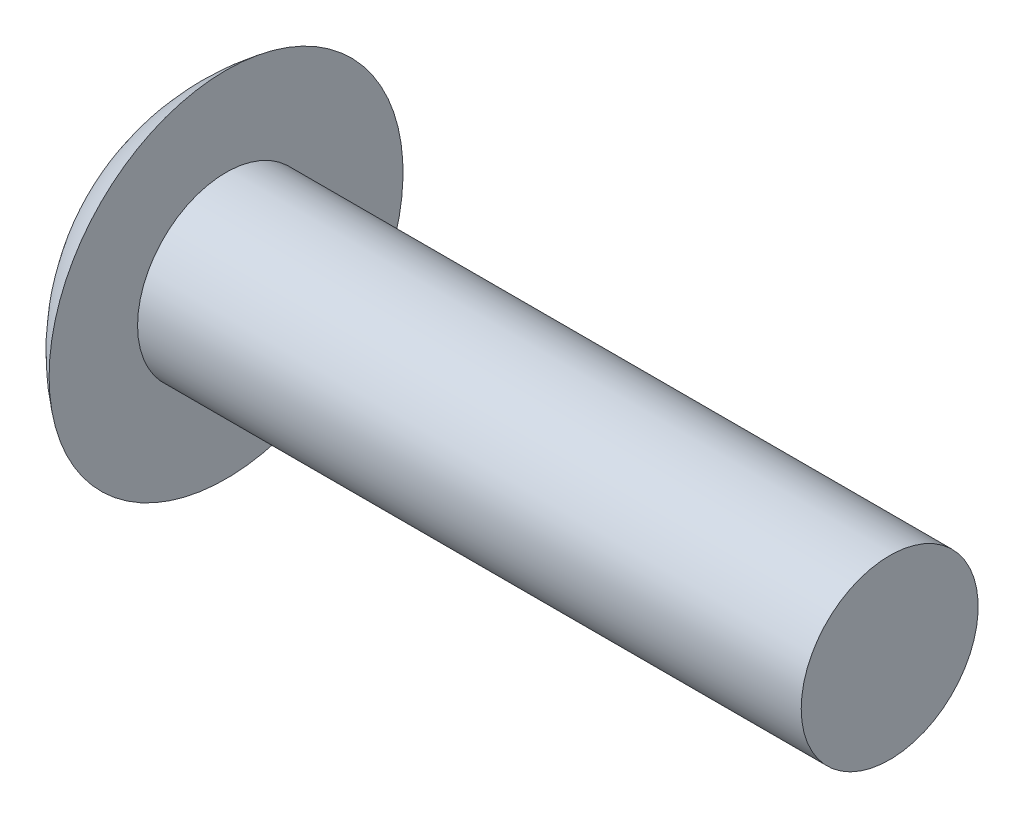
ISO-10303-21;
HEADER;
FILE_DESCRIPTION(('STEP AP214'),'2;1');
FILE_NAME('part.step','',(''),(''),'','','');
FILE_SCHEMA(('AUTOMOTIVE_DESIGN { 1 0 10303 214 1 1 1 1 }'));
ENDSEC;
DATA;
#1=APPLICATION_CONTEXT('core data for automotive mechanical design processes');
#2=APPLICATION_PROTOCOL_DEFINITION('international standard','automotive_design',2000,#1);
#3=PRODUCT_CONTEXT('',#1,'mechanical');
#4=PRODUCT('Part','Part','',(#3));
#5=PRODUCT_RELATED_PRODUCT_CATEGORY('part','',(#4));
#6=PRODUCT_DEFINITION_FORMATION('','',#4);
#7=PRODUCT_DEFINITION_CONTEXT('part definition',#1,'design');
#8=PRODUCT_DEFINITION('design','',#6,#7);
#9=PRODUCT_DEFINITION_SHAPE('','',#8);
#10=(LENGTH_UNIT() NAMED_UNIT(*) SI_UNIT(.MILLI.,.METRE.));
#11=(NAMED_UNIT(*) PLANE_ANGLE_UNIT() SI_UNIT($,.RADIAN.));
#12=(NAMED_UNIT(*) SI_UNIT($,.STERADIAN.) SOLID_ANGLE_UNIT());
#13=UNCERTAINTY_MEASURE_WITH_UNIT(LENGTH_MEASURE(1.E-05),#10,'distance_accuracy_value','');
#14=(GEOMETRIC_REPRESENTATION_CONTEXT(3) GLOBAL_UNCERTAINTY_ASSIGNED_CONTEXT((#13)) GLOBAL_UNIT_ASSIGNED_CONTEXT((#10,
#11,#12)) REPRESENTATION_CONTEXT('',''));
#15=CARTESIAN_POINT('',(0.,0.,0.));
#16=DIRECTION('',(0.,0.,1.));
#17=DIRECTION('',(1.,0.,0.));
#18=AXIS2_PLACEMENT_3D('',#15,#16,#17);
#19=CARTESIAN_POINT('',(5.,0.,0.));
#20=DIRECTION('',(-1.,0.,0.));
#21=DIRECTION('',(0.,1.,0.));
#22=AXIS2_PLACEMENT_3D('',#19,#20,#21);
#23=SPHERICAL_SURFACE('',#22,5.);
#24=CARTESIAN_POINT('',(2.,0.,0.));
#25=DIRECTION('',(-1.,0.,0.));
#26=DIRECTION('',(0.,0.,1.));
#27=AXIS2_PLACEMENT_3D('',#24,#25,#26);
#28=CIRCLE('',#27,4.);
#29=CARTESIAN_POINT('',(2.,0.,4.));
#30=VERTEX_POINT('',#29);
#31=EDGE_CURVE('E10',#30,#30,#28,.T.);
#32=ORIENTED_EDGE('',*,*,#31,.T.);
#33=EDGE_LOOP('',(#32));
#34=FACE_BOUND('',#33,.T.);
#35=ADVANCED_FACE('F31',(#34),#23,.T.);
#36=CARTESIAN_POINT('',(2.,1.99999999999999,0.));
#37=DIRECTION('',(-1.,0.,0.));
#38=DIRECTION('',(0.,0.,1.));
#39=AXIS2_PLACEMENT_3D('',#36,#37,#38);
#40=PLANE('',#39);
#41=ORIENTED_EDGE('',*,*,#31,.F.);
#42=EDGE_LOOP('',(#41));
#43=FACE_BOUND('',#42,.T.);
#44=CARTESIAN_POINT('',(2.,0.,0.));
#45=DIRECTION('',(-1.,0.,0.));
#46=DIRECTION('',(0.,0.,1.));
#47=AXIS2_PLACEMENT_3D('',#44,#45,#46);
#48=CIRCLE('',#47,1.99999999999999);
#49=CARTESIAN_POINT('',(2.,0.,1.99999999999999));
#50=VERTEX_POINT('',#49);
#51=EDGE_CURVE('E37',#50,#50,#48,.T.);
#52=ORIENTED_EDGE('',*,*,#51,.T.);
#53=EDGE_LOOP('',(#52));
#54=FACE_BOUND('',#53,.T.);
#55=ADVANCED_FACE('F56',(#43,#54),#40,.F.);
#56=CARTESIAN_POINT('',(0.,0.,0.));
#57=DIRECTION('',(-1.,0.,0.));
#58=DIRECTION('',(0.,0.,1.));
#59=AXIS2_PLACEMENT_3D('',#56,#57,#58);
#60=CYLINDRICAL_SURFACE('',#59,1.99999999999999);
#61=ORIENTED_EDGE('',*,*,#51,.F.);
#62=EDGE_LOOP('',(#61));
#63=FACE_BOUND('',#62,.T.);
#64=CARTESIAN_POINT('',(17.,0.,0.));
#65=DIRECTION('',(-1.,0.,0.));
#66=DIRECTION('',(0.,0.,1.));
#67=AXIS2_PLACEMENT_3D('',#64,#65,#66);
#68=CIRCLE('',#67,2.);
#69=CARTESIAN_POINT('',(17.,0.,2.));
#70=VERTEX_POINT('',#69);
#71=EDGE_CURVE('E41',#70,#70,#68,.T.);
#72=ORIENTED_EDGE('',*,*,#71,.T.);
#73=EDGE_LOOP('',(#72));
#74=FACE_BOUND('',#73,.T.);
#75=ADVANCED_FACE('F48',(#63,#74),#60,.T.);
#76=CARTESIAN_POINT('',(17.,0.,0.));
#77=DIRECTION('',(-1.,0.,0.));
#78=DIRECTION('',(0.,0.,1.));
#79=AXIS2_PLACEMENT_3D('',#76,#77,#78);
#80=PLANE('',#79);
#81=ORIENTED_EDGE('',*,*,#71,.F.);
#82=EDGE_LOOP('',(#81));
#83=FACE_BOUND('',#82,.T.);
#84=ADVANCED_FACE('F50',(#83),#80,.F.);
#85=CLOSED_SHELL('',(#35,#55,#75,#84));
#86=MANIFOLD_SOLID_BREP('B2',#85);
#87=ADVANCED_BREP_SHAPE_REPRESENTATION('',(#18,#86),#14);
#88=SHAPE_DEFINITION_REPRESENTATION(#9,#87);
ENDSEC;
END-ISO-10303-21;
